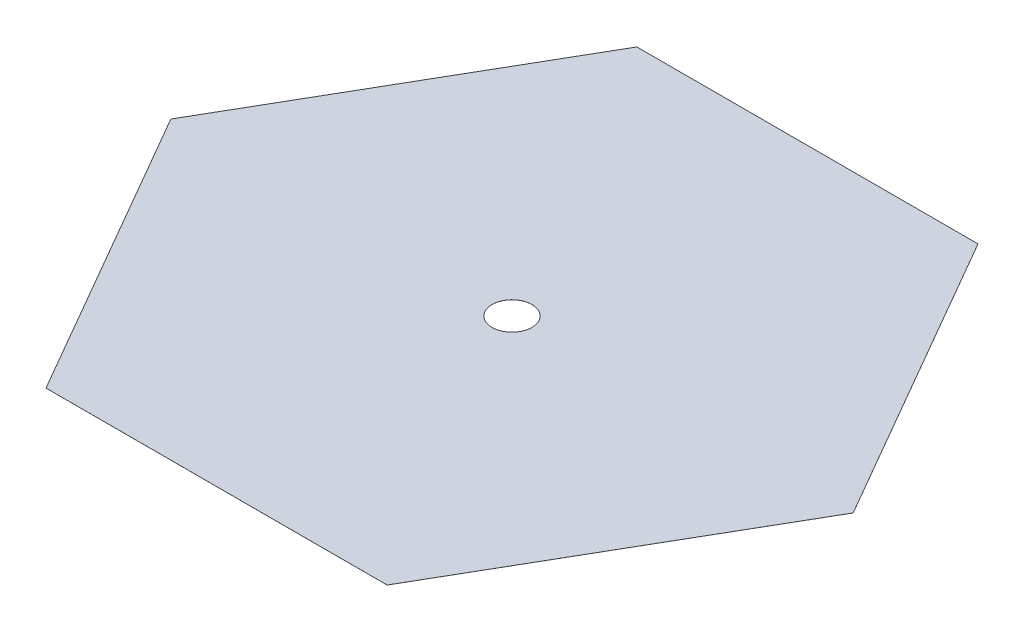
ISO-10303-21;
HEADER;
FILE_DESCRIPTION(('STEP AP214'),'2;1');
FILE_NAME('part.step','',(''),(''),'','','');
FILE_SCHEMA(('AUTOMOTIVE_DESIGN { 1 0 10303 214 1 1 1 1 }'));
ENDSEC;
DATA;
#1=APPLICATION_CONTEXT('core data for automotive mechanical design processes');
#2=APPLICATION_PROTOCOL_DEFINITION('international standard','automotive_design',2000,#1);
#3=PRODUCT_CONTEXT('',#1,'mechanical');
#4=PRODUCT('Part','Part','',(#3));
#5=PRODUCT_RELATED_PRODUCT_CATEGORY('part','',(#4));
#6=PRODUCT_DEFINITION_FORMATION('','',#4);
#7=PRODUCT_DEFINITION_CONTEXT('part definition',#1,'design');
#8=PRODUCT_DEFINITION('design','',#6,#7);
#9=PRODUCT_DEFINITION_SHAPE('','',#8);
#10=(LENGTH_UNIT() NAMED_UNIT(*) SI_UNIT(.MILLI.,.METRE.));
#11=(NAMED_UNIT(*) PLANE_ANGLE_UNIT() SI_UNIT($,.RADIAN.));
#12=(NAMED_UNIT(*) SI_UNIT($,.STERADIAN.) SOLID_ANGLE_UNIT());
#13=UNCERTAINTY_MEASURE_WITH_UNIT(LENGTH_MEASURE(1.E-05),#10,'distance_accuracy_value','');
#14=(GEOMETRIC_REPRESENTATION_CONTEXT(3) GLOBAL_UNCERTAINTY_ASSIGNED_CONTEXT((#13)) GLOBAL_UNIT_ASSIGNED_CONTEXT((#10,
#11,#12)) REPRESENTATION_CONTEXT('',''));
#15=CARTESIAN_POINT('',(0.,0.,0.));
#16=DIRECTION('',(0.,0.,1.));
#17=DIRECTION('',(1.,0.,0.));
#18=AXIS2_PLACEMENT_3D('',#15,#16,#17);
#19=CARTESIAN_POINT('',(-300.000000000006,0.06,-519.61524227066));
#20=DIRECTION('',(0.866025403784442,0.,0.499999999999995));
#21=DIRECTION('',(0.499999999999995,0.,-0.866025403784442));
#22=AXIS2_PLACEMENT_3D('',#19,#20,#21);
#23=PLANE('',#22);
#24=DIRECTION('',(-0.499999999999995,0.,0.866025403784442));
#25=VECTOR('',#24,1.);
#26=CARTESIAN_POINT('',(-300.000000000006,0.,-519.61524227066));
#27=LINE('',#26,#25);
#28=CARTESIAN_POINT('',(-300.000000000006,0.,-519.61524227066));
#29=VERTEX_POINT('',#28);
#30=CARTESIAN_POINT('',(-600.,0.,0.));
#31=VERTEX_POINT('',#30);
#32=EDGE_CURVE('E119',#29,#31,#27,.T.);
#33=ORIENTED_EDGE('',*,*,#32,.T.);
#34=DIRECTION('',(0.,-1.,0.));
#35=VECTOR('',#34,1.);
#36=CARTESIAN_POINT('',(-600.,0.06,0.));
#37=LINE('',#36,#35);
#38=CARTESIAN_POINT('',(-600.,0.06,0.));
#39=VERTEX_POINT('',#38);
#40=EDGE_CURVE('E11',#39,#31,#37,.T.);
#41=ORIENTED_EDGE('',*,*,#40,.F.);
#42=DIRECTION('',(-0.499999999999995,0.,0.866025403784442));
#43=VECTOR('',#42,1.);
#44=CARTESIAN_POINT('',(-300.000000000006,0.06,-519.61524227066));
#45=LINE('',#44,#43);
#46=CARTESIAN_POINT('',(-300.000000000006,0.06,-519.61524227066));
#47=VERTEX_POINT('',#46);
#48=EDGE_CURVE('E130',#47,#39,#45,.T.);
#49=ORIENTED_EDGE('',*,*,#48,.F.);
#50=DIRECTION('',(0.,-1.,0.));
#51=VECTOR('',#50,1.);
#52=CARTESIAN_POINT('',(-300.000000000006,0.06,-519.61524227066));
#53=LINE('',#52,#51);
#54=EDGE_CURVE('E115',#47,#29,#53,.T.);
#55=ORIENTED_EDGE('',*,*,#54,.T.);
#56=EDGE_LOOP('',(#33,#41,#49,#55));
#57=FACE_BOUND('',#56,.T.);
#58=ADVANCED_FACE('F35',(#57),#23,.F.);
#59=CARTESIAN_POINT('',(-600.,0.06,0.));
#60=DIRECTION('',(0.866025403784438,0.,-0.500000000000001));
#61=DIRECTION('',(-0.500000000000001,0.,-0.866025403784438));
#62=AXIS2_PLACEMENT_3D('',#59,#60,#61);
#63=PLANE('',#62);
#64=DIRECTION('',(0.500000000000001,0.,0.866025403784438));
#65=VECTOR('',#64,1.);
#66=CARTESIAN_POINT('',(-600.,0.,0.));
#67=LINE('',#66,#65);
#68=CARTESIAN_POINT('',(-299.999999999999,0.,519.615242270664));
#69=VERTEX_POINT('',#68);
#70=EDGE_CURVE('E122',#31,#69,#67,.T.);
#71=ORIENTED_EDGE('',*,*,#70,.T.);
#72=DIRECTION('',(0.,-1.,0.));
#73=VECTOR('',#72,1.);
#74=CARTESIAN_POINT('',(-299.999999999999,0.06,519.615242270664));
#75=LINE('',#74,#73);
#76=CARTESIAN_POINT('',(-299.999999999999,0.06,519.615242270664));
#77=VERTEX_POINT('',#76);
#78=EDGE_CURVE('E43',#77,#69,#75,.T.);
#79=ORIENTED_EDGE('',*,*,#78,.F.);
#80=DIRECTION('',(0.500000000000001,0.,0.866025403784438));
#81=VECTOR('',#80,1.);
#82=CARTESIAN_POINT('',(-600.,0.06,0.));
#83=LINE('',#82,#81);
#84=EDGE_CURVE('E88',#39,#77,#83,.T.);
#85=ORIENTED_EDGE('',*,*,#84,.F.);
#86=ORIENTED_EDGE('',*,*,#40,.T.);
#87=EDGE_LOOP('',(#71,#79,#85,#86));
#88=FACE_BOUND('',#87,.T.);
#89=ADVANCED_FACE('F155',(#88),#63,.F.);
#90=CARTESIAN_POINT('',(-299.999999999999,0.06,519.615242270664));
#91=DIRECTION('',(0.,0.,-1.));
#92=DIRECTION('',(-1.,0.,0.));
#93=AXIS2_PLACEMENT_3D('',#90,#91,#92);
#94=PLANE('',#93);
#95=DIRECTION('',(1.,0.,0.));
#96=VECTOR('',#95,1.);
#97=CARTESIAN_POINT('',(-299.999999999999,0.,519.615242270664));
#98=LINE('',#97,#96);
#99=CARTESIAN_POINT('',(300.000000000002,0.,519.615242270662));
#100=VERTEX_POINT('',#99);
#101=EDGE_CURVE('E125',#69,#100,#98,.T.);
#102=ORIENTED_EDGE('',*,*,#101,.T.);
#103=DIRECTION('',(0.,-1.,0.));
#104=VECTOR('',#103,1.);
#105=CARTESIAN_POINT('',(300.000000000002,0.06,519.615242270662));
#106=LINE('',#105,#104);
#107=CARTESIAN_POINT('',(300.000000000002,0.06,519.615242270662));
#108=VERTEX_POINT('',#107);
#109=EDGE_CURVE('E110',#108,#100,#106,.T.);
#110=ORIENTED_EDGE('',*,*,#109,.F.);
#111=DIRECTION('',(1.,0.,0.));
#112=VECTOR('',#111,1.);
#113=CARTESIAN_POINT('',(-299.999999999999,0.06,519.615242270664));
#114=LINE('',#113,#112);
#115=EDGE_CURVE('E101',#77,#108,#114,.T.);
#116=ORIENTED_EDGE('',*,*,#115,.F.);
#117=ORIENTED_EDGE('',*,*,#78,.T.);
#118=EDGE_LOOP('',(#102,#110,#116,#117));
#119=FACE_BOUND('',#118,.T.);
#120=ADVANCED_FACE('F136',(#119),#94,.F.);
#121=CARTESIAN_POINT('',(300.000000000002,0.06,519.615242270662));
#122=DIRECTION('',(-0.866025403784441,0.,-0.499999999999995));
#123=DIRECTION('',(-0.499999999999995,0.,0.866025403784442));
#124=AXIS2_PLACEMENT_3D('',#121,#122,#123);
#125=PLANE('',#124);
#126=DIRECTION('',(0.499999999999995,0.,-0.866025403784441));
#127=VECTOR('',#126,1.);
#128=CARTESIAN_POINT('',(300.000000000002,0.,519.615242270662));
#129=LINE('',#128,#127);
#130=CARTESIAN_POINT('',(600.,0.,-4.18977760661176E-12));
#131=VERTEX_POINT('',#130);
#132=EDGE_CURVE('E109',#100,#131,#129,.T.);
#133=ORIENTED_EDGE('',*,*,#132,.T.);
#134=DIRECTION('',(0.,-1.,0.));
#135=VECTOR('',#134,1.);
#136=CARTESIAN_POINT('',(600.,0.06,-4.18977760661176E-12));
#137=LINE('',#136,#135);
#138=CARTESIAN_POINT('',(600.,0.06,-4.18977760661176E-12));
#139=VERTEX_POINT('',#138);
#140=EDGE_CURVE('E106',#139,#131,#137,.T.);
#141=ORIENTED_EDGE('',*,*,#140,.F.);
#142=DIRECTION('',(0.499999999999995,0.,-0.866025403784441));
#143=VECTOR('',#142,1.);
#144=CARTESIAN_POINT('',(300.000000000002,0.06,519.615242270662));
#145=LINE('',#144,#143);
#146=EDGE_CURVE('E95',#108,#139,#145,.T.);
#147=ORIENTED_EDGE('',*,*,#146,.F.);
#148=ORIENTED_EDGE('',*,*,#109,.T.);
#149=EDGE_LOOP('',(#133,#141,#147,#148));
#150=FACE_BOUND('',#149,.T.);
#151=ADVANCED_FACE('F107',(#150),#125,.F.);
#152=CARTESIAN_POINT('',(600.,0.06,-4.18977760661176E-12));
#153=DIRECTION('',(-0.866025403784435,0.,0.500000000000007));
#154=DIRECTION('',(0.500000000000007,0.,0.866025403784435));
#155=AXIS2_PLACEMENT_3D('',#152,#153,#154);
#156=PLANE('',#155);
#157=DIRECTION('',(-0.500000000000007,0.,-0.866025403784435));
#158=VECTOR('',#157,1.);
#159=CARTESIAN_POINT('',(600.,0.,-4.18977760661176E-12));
#160=LINE('',#159,#158);
#161=CARTESIAN_POINT('',(299.999999999995,0.,-519.615242270666));
#162=VERTEX_POINT('',#161);
#163=EDGE_CURVE('E74',#131,#162,#160,.T.);
#164=ORIENTED_EDGE('',*,*,#163,.T.);
#165=DIRECTION('',(0.,-1.,0.));
#166=VECTOR('',#165,1.);
#167=CARTESIAN_POINT('',(299.999999999995,0.06,-519.615242270666));
#168=LINE('',#167,#166);
#169=CARTESIAN_POINT('',(299.999999999995,0.06,-519.615242270666));
#170=VERTEX_POINT('',#169);
#171=EDGE_CURVE('E111',#170,#162,#168,.T.);
#172=ORIENTED_EDGE('',*,*,#171,.F.);
#173=DIRECTION('',(-0.500000000000007,0.,-0.866025403784435));
#174=VECTOR('',#173,1.);
#175=CARTESIAN_POINT('',(600.,0.06,-4.18977760661176E-12));
#176=LINE('',#175,#174);
#177=EDGE_CURVE('E99',#139,#170,#176,.T.);
#178=ORIENTED_EDGE('',*,*,#177,.F.);
#179=ORIENTED_EDGE('',*,*,#140,.T.);
#180=EDGE_LOOP('',(#164,#172,#178,#179));
#181=FACE_BOUND('',#180,.T.);
#182=ADVANCED_FACE('F113',(#181),#156,.F.);
#183=CARTESIAN_POINT('',(299.999999999995,0.06,-519.615242270666));
#184=DIRECTION('',(0.,0.,1.));
#185=DIRECTION('',(1.,0.,0.));
#186=AXIS2_PLACEMENT_3D('',#183,#184,#185);
#187=PLANE('',#186);
#188=DIRECTION('',(-1.,0.,0.));
#189=VECTOR('',#188,1.);
#190=CARTESIAN_POINT('',(299.999999999995,0.,-519.615242270666));
#191=LINE('',#190,#189);
#192=EDGE_CURVE('E80',#162,#29,#191,.T.);
#193=ORIENTED_EDGE('',*,*,#192,.T.);
#194=ORIENTED_EDGE('',*,*,#54,.F.);
#195=DIRECTION('',(-1.,0.,0.));
#196=VECTOR('',#195,1.);
#197=CARTESIAN_POINT('',(299.999999999995,0.06,-519.615242270666));
#198=LINE('',#197,#196);
#199=EDGE_CURVE('E51',#170,#47,#198,.T.);
#200=ORIENTED_EDGE('',*,*,#199,.F.);
#201=ORIENTED_EDGE('',*,*,#171,.T.);
#202=EDGE_LOOP('',(#193,#194,#200,#201));
#203=FACE_BOUND('',#202,.T.);
#204=ADVANCED_FACE('F143',(#203),#187,.F.);
#205=CARTESIAN_POINT('',(0.,0.06,0.));
#206=DIRECTION('',(0.,1.,0.));
#207=DIRECTION('',(0.,0.,1.));
#208=AXIS2_PLACEMENT_3D('',#205,#206,#207);
#209=PLANE('',#208);
#210=CARTESIAN_POINT('',(0.,0.06,0.));
#211=DIRECTION('',(0.,1.,0.));
#212=DIRECTION('',(0.,0.,1.));
#213=AXIS2_PLACEMENT_3D('',#210,#211,#212);
#214=CIRCLE('',#213,35.);
#215=CARTESIAN_POINT('',(0.,0.06,35.));
#216=VERTEX_POINT('',#215);
#217=EDGE_CURVE('E210',#216,#216,#214,.T.);
#218=ORIENTED_EDGE('',*,*,#217,.F.);
#219=EDGE_LOOP('',(#218));
#220=FACE_BOUND('',#219,.T.);
#221=ORIENTED_EDGE('',*,*,#48,.T.);
#222=ORIENTED_EDGE('',*,*,#84,.T.);
#223=ORIENTED_EDGE('',*,*,#115,.T.);
#224=ORIENTED_EDGE('',*,*,#146,.T.);
#225=ORIENTED_EDGE('',*,*,#177,.T.);
#226=ORIENTED_EDGE('',*,*,#199,.T.);
#227=EDGE_LOOP('',(#221,#222,#223,#224,#225,#226));
#228=FACE_BOUND('',#227,.T.);
#229=ADVANCED_FACE('F97',(#220,#228),#209,.T.);
#230=CARTESIAN_POINT('',(0.,0.,0.));
#231=DIRECTION('',(0.,1.,0.));
#232=DIRECTION('',(0.,0.,1.));
#233=AXIS2_PLACEMENT_3D('',#230,#231,#232);
#234=PLANE('',#233);
#235=CARTESIAN_POINT('',(0.,0.,0.));
#236=DIRECTION('',(0.,1.,0.));
#237=DIRECTION('',(0.,0.,1.));
#238=AXIS2_PLACEMENT_3D('',#235,#236,#237);
#239=CIRCLE('',#238,35.);
#240=CARTESIAN_POINT('',(0.,0.,35.));
#241=VERTEX_POINT('',#240);
#242=EDGE_CURVE('E123',#241,#241,#239,.T.);
#243=ORIENTED_EDGE('',*,*,#242,.T.);
#244=EDGE_LOOP('',(#243));
#245=FACE_BOUND('',#244,.T.);
#246=ORIENTED_EDGE('',*,*,#32,.F.);
#247=ORIENTED_EDGE('',*,*,#192,.F.);
#248=ORIENTED_EDGE('',*,*,#163,.F.);
#249=ORIENTED_EDGE('',*,*,#132,.F.);
#250=ORIENTED_EDGE('',*,*,#101,.F.);
#251=ORIENTED_EDGE('',*,*,#70,.F.);
#252=EDGE_LOOP('',(#246,#247,#248,#249,#250,#251));
#253=FACE_BOUND('',#252,.T.);
#254=ADVANCED_FACE('F139',(#245,#253),#234,.F.);
#255=CARTESIAN_POINT('',(0.,0.,0.));
#256=DIRECTION('',(0.,1.,0.));
#257=DIRECTION('',(0.,0.,1.));
#258=AXIS2_PLACEMENT_3D('',#255,#256,#257);
#259=CYLINDRICAL_SURFACE('',#258,35.);
#260=ORIENTED_EDGE('',*,*,#242,.F.);
#261=EDGE_LOOP('',(#260));
#262=FACE_BOUND('',#261,.T.);
#263=ORIENTED_EDGE('',*,*,#217,.T.);
#264=EDGE_LOOP('',(#263));
#265=FACE_BOUND('',#264,.T.);
#266=ADVANCED_FACE('F192',(#262,#265),#259,.F.);
#267=CLOSED_SHELL('',(#58,#89,#120,#151,#182,#204,#229,#254,#266));
#268=MANIFOLD_SOLID_BREP('B2',#267);
#269=ADVANCED_BREP_SHAPE_REPRESENTATION('',(#18,#268),#14);
#270=SHAPE_DEFINITION_REPRESENTATION(#9,#269);
ENDSEC;
END-ISO-10303-21;
